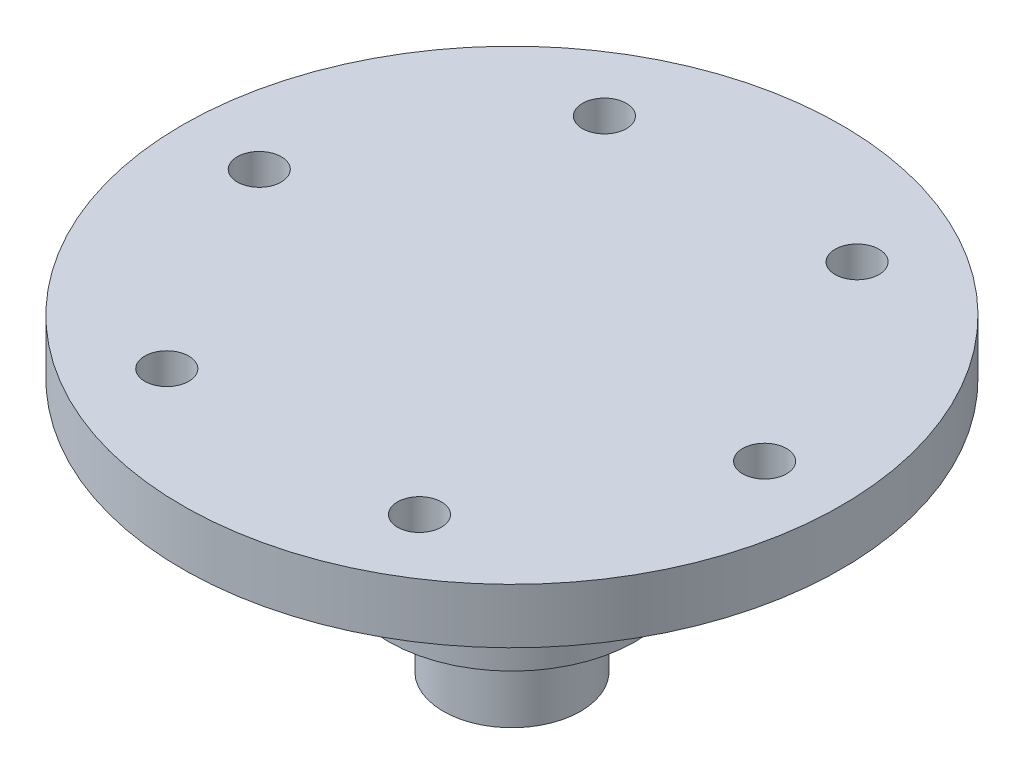
ISO-10303-21;
HEADER;
FILE_DESCRIPTION(('STEP AP214'),'2;1');
FILE_NAME('part.step','',(''),(''),'','','');
FILE_SCHEMA(('AUTOMOTIVE_DESIGN { 1 0 10303 214 1 1 1 1 }'));
ENDSEC;
DATA;
#1=APPLICATION_CONTEXT('core data for automotive mechanical design processes');
#2=APPLICATION_PROTOCOL_DEFINITION('international standard','automotive_design',2000,#1);
#3=PRODUCT_CONTEXT('',#1,'mechanical');
#4=PRODUCT('Part','Part','',(#3));
#5=PRODUCT_RELATED_PRODUCT_CATEGORY('part','',(#4));
#6=PRODUCT_DEFINITION_FORMATION('','',#4);
#7=PRODUCT_DEFINITION_CONTEXT('part definition',#1,'design');
#8=PRODUCT_DEFINITION('design','',#6,#7);
#9=PRODUCT_DEFINITION_SHAPE('','',#8);
#10=(LENGTH_UNIT() NAMED_UNIT(*) SI_UNIT(.MILLI.,.METRE.));
#11=(NAMED_UNIT(*) PLANE_ANGLE_UNIT() SI_UNIT($,.RADIAN.));
#12=(NAMED_UNIT(*) SI_UNIT($,.STERADIAN.) SOLID_ANGLE_UNIT());
#13=UNCERTAINTY_MEASURE_WITH_UNIT(LENGTH_MEASURE(1.E-05),#10,'distance_accuracy_value','');
#14=(GEOMETRIC_REPRESENTATION_CONTEXT(3) GLOBAL_UNCERTAINTY_ASSIGNED_CONTEXT((#13)) GLOBAL_UNIT_ASSIGNED_CONTEXT((#10,
#11,#12)) REPRESENTATION_CONTEXT('',''));
#15=CARTESIAN_POINT('',(0.,0.,0.));
#16=DIRECTION('',(0.,0.,1.));
#17=DIRECTION('',(1.,0.,0.));
#18=AXIS2_PLACEMENT_3D('',#15,#16,#17);
#19=CARTESIAN_POINT('',(0.,0.,0.));
#20=DIRECTION('',(0.,1.,0.));
#21=DIRECTION('',(-1.,0.,0.));
#22=AXIS2_PLACEMENT_3D('',#19,#20,#21);
#23=CYLINDRICAL_SURFACE('',#22,6.25);
#24=CARTESIAN_POINT('',(0.,3.,0.));
#25=DIRECTION('',(0.,1.,0.));
#26=DIRECTION('',(-1.,0.,0.));
#27=AXIS2_PLACEMENT_3D('',#24,#25,#26);
#28=CIRCLE('',#27,6.25);
#29=CARTESIAN_POINT('',(6.25,3.,0.));
#30=VERTEX_POINT('',#29);
#31=EDGE_CURVE('E24',#30,#30,#28,.T.);
#32=ORIENTED_EDGE('',*,*,#31,.F.);
#33=DIRECTION('',(0.,-1.,0.));
#34=VECTOR('',#33,1.);
#35=CARTESIAN_POINT('',(6.25,0.,0.));
#36=LINE('',#35,#34);
#37=CARTESIAN_POINT('',(6.25,-5.,0.));
#38=VERTEX_POINT('',#37);
#39=EDGE_CURVE('E12',#30,#38,#36,.T.);
#40=ORIENTED_EDGE('',*,*,#39,.T.);
#41=CARTESIAN_POINT('',(0.,-5.,0.));
#42=DIRECTION('',(0.,-1.,0.));
#43=DIRECTION('',(1.,0.,0.));
#44=AXIS2_PLACEMENT_3D('',#41,#42,#43);
#45=CIRCLE('',#44,6.25);
#46=EDGE_CURVE('E120',#38,#38,#45,.T.);
#47=ORIENTED_EDGE('',*,*,#46,.F.);
#48=ORIENTED_EDGE('',*,*,#39,.F.);
#49=EDGE_LOOP('',(#32,#40,#47,#48));
#50=FACE_BOUND('',#49,.T.);
#51=ADVANCED_FACE('F20',(#50),#23,.T.);
#52=CARTESIAN_POINT('',(0.,3.,0.));
#53=DIRECTION('',(0.,1.,0.));
#54=DIRECTION('',(1.,0.,0.));
#55=AXIS2_PLACEMENT_3D('',#52,#53,#54);
#56=CYLINDRICAL_SURFACE('',#55,11.25);
#57=CARTESIAN_POINT('',(0.,15.1,0.));
#58=DIRECTION('',(0.,1.,0.));
#59=DIRECTION('',(1.,0.,0.));
#60=AXIS2_PLACEMENT_3D('',#57,#58,#59);
#61=CIRCLE('',#60,11.25);
#62=CARTESIAN_POINT('',(-11.25,15.1,0.));
#63=VERTEX_POINT('',#62);
#64=EDGE_CURVE('E191',#63,#63,#61,.T.);
#65=ORIENTED_EDGE('',*,*,#64,.F.);
#66=DIRECTION('',(0.,-1.,0.));
#67=VECTOR('',#66,1.);
#68=CARTESIAN_POINT('',(-11.25,3.,0.));
#69=LINE('',#68,#67);
#70=CARTESIAN_POINT('',(-11.25,3.,0.));
#71=VERTEX_POINT('',#70);
#72=EDGE_CURVE('E32',#63,#71,#69,.T.);
#73=ORIENTED_EDGE('',*,*,#72,.T.);
#74=CARTESIAN_POINT('',(0.,3.,0.));
#75=DIRECTION('',(0.,1.,0.));
#76=DIRECTION('',(1.,0.,0.));
#77=AXIS2_PLACEMENT_3D('',#74,#75,#76);
#78=CIRCLE('',#77,11.25);
#79=EDGE_CURVE('E173',#71,#71,#78,.T.);
#80=ORIENTED_EDGE('',*,*,#79,.T.);
#81=ORIENTED_EDGE('',*,*,#72,.F.);
#82=EDGE_LOOP('',(#65,#73,#80,#81));
#83=FACE_BOUND('',#82,.T.);
#84=ADVANCED_FACE('F254',(#83),#56,.T.);
#85=CARTESIAN_POINT('',(0.,3.,0.));
#86=DIRECTION('',(0.,1.,0.));
#87=DIRECTION('',(1.,0.,0.));
#88=AXIS2_PLACEMENT_3D('',#85,#86,#87);
#89=PLANE('',#88);
#90=ORIENTED_EDGE('',*,*,#31,.T.);
#91=EDGE_LOOP('',(#90));
#92=FACE_BOUND('',#91,.T.);
#93=ORIENTED_EDGE('',*,*,#79,.F.);
#94=EDGE_LOOP('',(#93));
#95=FACE_BOUND('',#94,.T.);
#96=ADVANCED_FACE('F243',(#92,#95),#89,.F.);
#97=CARTESIAN_POINT('',(0.,15.1,0.));
#98=DIRECTION('',(0.,1.,0.));
#99=DIRECTION('',(1.,0.,0.));
#100=AXIS2_PLACEMENT_3D('',#97,#98,#99);
#101=CYLINDRICAL_SURFACE('',#100,13.);
#102=CARTESIAN_POINT('',(0.,18.1,0.));
#103=DIRECTION('',(0.,1.,0.));
#104=DIRECTION('',(1.,0.,0.));
#105=AXIS2_PLACEMENT_3D('',#102,#103,#104);
#106=CIRCLE('',#105,13.);
#107=CARTESIAN_POINT('',(-13.,18.1,0.));
#108=VERTEX_POINT('',#107);
#109=EDGE_CURVE('E132',#108,#108,#106,.T.);
#110=ORIENTED_EDGE('',*,*,#109,.F.);
#111=DIRECTION('',(0.,-1.,0.));
#112=VECTOR('',#111,1.);
#113=CARTESIAN_POINT('',(-13.,15.1,0.));
#114=LINE('',#113,#112);
#115=CARTESIAN_POINT('',(-13.,15.1,0.));
#116=VERTEX_POINT('',#115);
#117=EDGE_CURVE('E177',#108,#116,#114,.T.);
#118=ORIENTED_EDGE('',*,*,#117,.T.);
#119=CARTESIAN_POINT('',(0.,15.1,0.));
#120=DIRECTION('',(0.,1.,0.));
#121=DIRECTION('',(1.,0.,0.));
#122=AXIS2_PLACEMENT_3D('',#119,#120,#121);
#123=CIRCLE('',#122,13.);
#124=EDGE_CURVE('E186',#116,#116,#123,.T.);
#125=ORIENTED_EDGE('',*,*,#124,.T.);
#126=ORIENTED_EDGE('',*,*,#117,.F.);
#127=EDGE_LOOP('',(#110,#118,#125,#126));
#128=FACE_BOUND('',#127,.T.);
#129=ADVANCED_FACE('F274',(#128),#101,.T.);
#130=CARTESIAN_POINT('',(0.,15.1,0.));
#131=DIRECTION('',(0.,1.,0.));
#132=DIRECTION('',(1.,0.,0.));
#133=AXIS2_PLACEMENT_3D('',#130,#131,#132);
#134=PLANE('',#133);
#135=ORIENTED_EDGE('',*,*,#64,.T.);
#136=EDGE_LOOP('',(#135));
#137=FACE_BOUND('',#136,.T.);
#138=ORIENTED_EDGE('',*,*,#124,.F.);
#139=EDGE_LOOP('',(#138));
#140=FACE_BOUND('',#139,.T.);
#141=ADVANCED_FACE('F276',(#137,#140),#134,.F.);
#142=CARTESIAN_POINT('',(0.,23.1,0.));
#143=DIRECTION('',(0.,1.,0.));
#144=DIRECTION('',(1.,0.,0.));
#145=AXIS2_PLACEMENT_3D('',#142,#143,#144);
#146=PLANE('',#145);
#147=CARTESIAN_POINT('',(-23.,23.1,0.));
#148=DIRECTION('',(0.,-1.,0.));
#149=DIRECTION('',(1.,0.,0.));
#150=AXIS2_PLACEMENT_3D('',#147,#148,#149);
#151=CIRCLE('',#150,2.);
#152=CARTESIAN_POINT('',(-25.,23.1,0.));
#153=VERTEX_POINT('',#152);
#154=EDGE_CURVE('E155',#153,#153,#151,.T.);
#155=ORIENTED_EDGE('',*,*,#154,.T.);
#156=EDGE_LOOP('',(#155));
#157=FACE_BOUND('',#156,.T.);
#158=CARTESIAN_POINT('',(-11.5,23.1,19.9185842870421));
#159=DIRECTION('',(0.,-1.,0.));
#160=DIRECTION('',(0.5,0.,-0.866025403784439));
#161=AXIS2_PLACEMENT_3D('',#158,#159,#160);
#162=CIRCLE('',#161,2.);
#163=CARTESIAN_POINT('',(-12.5,23.1,21.650635094611));
#164=VERTEX_POINT('',#163);
#165=EDGE_CURVE('E170',#164,#164,#162,.T.);
#166=ORIENTED_EDGE('',*,*,#165,.T.);
#167=EDGE_LOOP('',(#166));
#168=FACE_BOUND('',#167,.T.);
#169=CARTESIAN_POINT('',(11.5,23.1,19.9185842870421));
#170=DIRECTION('',(0.,-1.,0.));
#171=DIRECTION('',(-0.5,0.,-0.866025403784439));
#172=AXIS2_PLACEMENT_3D('',#169,#170,#171);
#173=CIRCLE('',#172,2.);
#174=CARTESIAN_POINT('',(12.5,23.1,21.650635094611));
#175=VERTEX_POINT('',#174);
#176=EDGE_CURVE('E148',#175,#175,#173,.T.);
#177=ORIENTED_EDGE('',*,*,#176,.T.);
#178=EDGE_LOOP('',(#177));
#179=FACE_BOUND('',#178,.T.);
#180=CARTESIAN_POINT('',(23.,23.1,0.));
#181=DIRECTION('',(0.,-1.,0.));
#182=DIRECTION('',(-1.,0.,0.));
#183=AXIS2_PLACEMENT_3D('',#180,#181,#182);
#184=CIRCLE('',#183,2.);
#185=CARTESIAN_POINT('',(25.,23.1,0.));
#186=VERTEX_POINT('',#185);
#187=EDGE_CURVE('E220',#186,#186,#184,.T.);
#188=ORIENTED_EDGE('',*,*,#187,.T.);
#189=EDGE_LOOP('',(#188));
#190=FACE_BOUND('',#189,.T.);
#191=CARTESIAN_POINT('',(11.5,23.1,-19.9185842870421));
#192=DIRECTION('',(0.,-1.,0.));
#193=DIRECTION('',(-0.5,0.,0.866025403784438));
#194=AXIS2_PLACEMENT_3D('',#191,#192,#193);
#195=CIRCLE('',#194,2.);
#196=CARTESIAN_POINT('',(12.5,23.1,-21.650635094611));
#197=VERTEX_POINT('',#196);
#198=EDGE_CURVE('E157',#197,#197,#195,.T.);
#199=ORIENTED_EDGE('',*,*,#198,.T.);
#200=EDGE_LOOP('',(#199));
#201=FACE_BOUND('',#200,.T.);
#202=CARTESIAN_POINT('',(-11.5,23.1,-19.9185842870421));
#203=DIRECTION('',(0.,-1.,0.));
#204=DIRECTION('',(0.5,0.,0.866025403784439));
#205=AXIS2_PLACEMENT_3D('',#202,#203,#204);
#206=CIRCLE('',#205,2.);
#207=CARTESIAN_POINT('',(-12.5,23.1,-21.650635094611));
#208=VERTEX_POINT('',#207);
#209=EDGE_CURVE('E112',#208,#208,#206,.T.);
#210=ORIENTED_EDGE('',*,*,#209,.T.);
#211=EDGE_LOOP('',(#210));
#212=FACE_BOUND('',#211,.T.);
#213=CARTESIAN_POINT('',(0.,23.1,0.));
#214=DIRECTION('',(0.,1.,0.));
#215=DIRECTION('',(1.,0.,0.));
#216=AXIS2_PLACEMENT_3D('',#213,#214,#215);
#217=CIRCLE('',#216,30.);
#218=CARTESIAN_POINT('',(-30.,23.1,0.));
#219=VERTEX_POINT('',#218);
#220=EDGE_CURVE('E476',#219,#219,#217,.T.);
#221=ORIENTED_EDGE('',*,*,#220,.T.);
#222=EDGE_LOOP('',(#221));
#223=FACE_BOUND('',#222,.T.);
#224=ADVANCED_FACE('F117',(#157,#168,#179,#190,#201,#212,#223),#146,.T.);
#225=CARTESIAN_POINT('',(0.,18.1,0.));
#226=DIRECTION('',(0.,1.,0.));
#227=DIRECTION('',(1.,0.,0.));
#228=AXIS2_PLACEMENT_3D('',#225,#226,#227);
#229=CYLINDRICAL_SURFACE('',#228,30.);
#230=ORIENTED_EDGE('',*,*,#220,.F.);
#231=DIRECTION('',(0.,-1.,0.));
#232=VECTOR('',#231,1.);
#233=CARTESIAN_POINT('',(-30.,18.1,0.));
#234=LINE('',#233,#232);
#235=CARTESIAN_POINT('',(-30.,18.1,0.));
#236=VERTEX_POINT('',#235);
#237=EDGE_CURVE('E172',#219,#236,#234,.T.);
#238=ORIENTED_EDGE('',*,*,#237,.T.);
#239=CARTESIAN_POINT('',(0.,18.1,0.));
#240=DIRECTION('',(0.,1.,0.));
#241=DIRECTION('',(1.,0.,0.));
#242=AXIS2_PLACEMENT_3D('',#239,#240,#241);
#243=CIRCLE('',#242,30.);
#244=EDGE_CURVE('E141',#236,#236,#243,.T.);
#245=ORIENTED_EDGE('',*,*,#244,.T.);
#246=ORIENTED_EDGE('',*,*,#237,.F.);
#247=EDGE_LOOP('',(#230,#238,#245,#246));
#248=FACE_BOUND('',#247,.T.);
#249=ADVANCED_FACE('F262',(#248),#229,.T.);
#250=CARTESIAN_POINT('',(0.,18.1,0.));
#251=DIRECTION('',(0.,1.,0.));
#252=DIRECTION('',(1.,0.,0.));
#253=AXIS2_PLACEMENT_3D('',#250,#251,#252);
#254=PLANE('',#253);
#255=ORIENTED_EDGE('',*,*,#109,.T.);
#256=EDGE_LOOP('',(#255));
#257=FACE_BOUND('',#256,.T.);
#258=CARTESIAN_POINT('',(-23.,18.1,0.));
#259=DIRECTION('',(0.,1.,0.));
#260=DIRECTION('',(1.,0.,0.));
#261=AXIS2_PLACEMENT_3D('',#258,#259,#260);
#262=CIRCLE('',#261,2.);
#263=CARTESIAN_POINT('',(-25.,18.1,0.));
#264=VERTEX_POINT('',#263);
#265=EDGE_CURVE('E147',#264,#264,#262,.T.);
#266=ORIENTED_EDGE('',*,*,#265,.T.);
#267=EDGE_LOOP('',(#266));
#268=FACE_BOUND('',#267,.T.);
#269=CARTESIAN_POINT('',(-11.5,18.1,19.9185842870421));
#270=DIRECTION('',(0.,1.,0.));
#271=DIRECTION('',(0.5,0.,-0.866025403784439));
#272=AXIS2_PLACEMENT_3D('',#269,#270,#271);
#273=CIRCLE('',#272,2.);
#274=CARTESIAN_POINT('',(-12.5,18.1,21.650635094611));
#275=VERTEX_POINT('',#274);
#276=EDGE_CURVE('E151',#275,#275,#273,.T.);
#277=ORIENTED_EDGE('',*,*,#276,.T.);
#278=EDGE_LOOP('',(#277));
#279=FACE_BOUND('',#278,.T.);
#280=CARTESIAN_POINT('',(11.5,18.1,19.9185842870421));
#281=DIRECTION('',(0.,1.,0.));
#282=DIRECTION('',(-0.5,0.,-0.866025403784439));
#283=AXIS2_PLACEMENT_3D('',#280,#281,#282);
#284=CIRCLE('',#283,2.);
#285=CARTESIAN_POINT('',(12.5,18.1,21.650635094611));
#286=VERTEX_POINT('',#285);
#287=EDGE_CURVE('E165',#286,#286,#284,.T.);
#288=ORIENTED_EDGE('',*,*,#287,.T.);
#289=EDGE_LOOP('',(#288));
#290=FACE_BOUND('',#289,.T.);
#291=CARTESIAN_POINT('',(23.,18.1,0.));
#292=DIRECTION('',(0.,1.,0.));
#293=DIRECTION('',(-1.,0.,0.));
#294=AXIS2_PLACEMENT_3D('',#291,#292,#293);
#295=CIRCLE('',#294,2.);
#296=CARTESIAN_POINT('',(25.,18.1,0.));
#297=VERTEX_POINT('',#296);
#298=EDGE_CURVE('E129',#297,#297,#295,.T.);
#299=ORIENTED_EDGE('',*,*,#298,.T.);
#300=EDGE_LOOP('',(#299));
#301=FACE_BOUND('',#300,.T.);
#302=CARTESIAN_POINT('',(11.5,18.1,-19.9185842870421));
#303=DIRECTION('',(0.,1.,0.));
#304=DIRECTION('',(-0.5,0.,0.866025403784438));
#305=AXIS2_PLACEMENT_3D('',#302,#303,#304);
#306=CIRCLE('',#305,2.);
#307=CARTESIAN_POINT('',(12.5,18.1,-21.650635094611));
#308=VERTEX_POINT('',#307);
#309=EDGE_CURVE('E289',#308,#308,#306,.T.);
#310=ORIENTED_EDGE('',*,*,#309,.T.);
#311=EDGE_LOOP('',(#310));
#312=FACE_BOUND('',#311,.T.);
#313=CARTESIAN_POINT('',(-11.5,18.1,-19.9185842870421));
#314=DIRECTION('',(0.,1.,0.));
#315=DIRECTION('',(0.5,0.,0.866025403784439));
#316=AXIS2_PLACEMENT_3D('',#313,#314,#315);
#317=CIRCLE('',#316,2.);
#318=CARTESIAN_POINT('',(-12.5,18.1,-21.650635094611));
#319=VERTEX_POINT('',#318);
#320=EDGE_CURVE('E113',#319,#319,#317,.T.);
#321=ORIENTED_EDGE('',*,*,#320,.T.);
#322=EDGE_LOOP('',(#321));
#323=FACE_BOUND('',#322,.T.);
#324=ORIENTED_EDGE('',*,*,#244,.F.);
#325=EDGE_LOOP('',(#324));
#326=FACE_BOUND('',#325,.T.);
#327=ADVANCED_FACE('F268',(#257,#268,#279,#290,#301,#312,#323,#326),#254,.F.);
#328=CARTESIAN_POINT('',(-23.,23.1,0.));
#329=DIRECTION('',(0.,-1.,0.));
#330=DIRECTION('',(1.,0.,0.));
#331=AXIS2_PLACEMENT_3D('',#328,#329,#330);
#332=CYLINDRICAL_SURFACE('',#331,2.);
#333=ORIENTED_EDGE('',*,*,#154,.F.);
#334=DIRECTION('',(0.,-1.,0.));
#335=VECTOR('',#334,1.);
#336=CARTESIAN_POINT('',(-25.,23.1,0.));
#337=LINE('',#336,#335);
#338=EDGE_CURVE('E196',#153,#264,#337,.T.);
#339=ORIENTED_EDGE('',*,*,#338,.T.);
#340=ORIENTED_EDGE('',*,*,#265,.F.);
#341=ORIENTED_EDGE('',*,*,#338,.F.);
#342=EDGE_LOOP('',(#333,#339,#340,#341));
#343=FACE_BOUND('',#342,.T.);
#344=ADVANCED_FACE('F264',(#343),#332,.F.);
#345=CARTESIAN_POINT('',(-11.5,23.1,19.9185842870421));
#346=DIRECTION('',(0.,-1.,0.));
#347=DIRECTION('',(0.5,0.,-0.866025403784439));
#348=AXIS2_PLACEMENT_3D('',#345,#346,#347);
#349=CYLINDRICAL_SURFACE('',#348,2.);
#350=ORIENTED_EDGE('',*,*,#165,.F.);
#351=DIRECTION('',(0.,-1.,0.));
#352=VECTOR('',#351,1.);
#353=CARTESIAN_POINT('',(-12.5,23.1,21.650635094611));
#354=LINE('',#353,#352);
#355=EDGE_CURVE('E156',#164,#275,#354,.T.);
#356=ORIENTED_EDGE('',*,*,#355,.T.);
#357=ORIENTED_EDGE('',*,*,#276,.F.);
#358=ORIENTED_EDGE('',*,*,#355,.F.);
#359=EDGE_LOOP('',(#350,#356,#357,#358));
#360=FACE_BOUND('',#359,.T.);
#361=ADVANCED_FACE('F267',(#360),#349,.F.);
#362=CARTESIAN_POINT('',(11.5,23.1,19.9185842870421));
#363=DIRECTION('',(0.,-1.,0.));
#364=DIRECTION('',(-0.5,0.,-0.866025403784439));
#365=AXIS2_PLACEMENT_3D('',#362,#363,#364);
#366=CYLINDRICAL_SURFACE('',#365,2.);
#367=ORIENTED_EDGE('',*,*,#176,.F.);
#368=DIRECTION('',(0.,-1.,0.));
#369=VECTOR('',#368,1.);
#370=CARTESIAN_POINT('',(12.5,23.1,21.650635094611));
#371=LINE('',#370,#369);
#372=EDGE_CURVE('E171',#175,#286,#371,.T.);
#373=ORIENTED_EDGE('',*,*,#372,.T.);
#374=ORIENTED_EDGE('',*,*,#287,.F.);
#375=ORIENTED_EDGE('',*,*,#372,.F.);
#376=EDGE_LOOP('',(#367,#373,#374,#375));
#377=FACE_BOUND('',#376,.T.);
#378=ADVANCED_FACE('F269',(#377),#366,.F.);
#379=CARTESIAN_POINT('',(23.,23.1,0.));
#380=DIRECTION('',(0.,-1.,0.));
#381=DIRECTION('',(-1.,0.,0.));
#382=AXIS2_PLACEMENT_3D('',#379,#380,#381);
#383=CYLINDRICAL_SURFACE('',#382,2.);
#384=ORIENTED_EDGE('',*,*,#187,.F.);
#385=DIRECTION('',(0.,-1.,0.));
#386=VECTOR('',#385,1.);
#387=CARTESIAN_POINT('',(25.,23.1,0.));
#388=LINE('',#387,#386);
#389=EDGE_CURVE('E217',#186,#297,#388,.T.);
#390=ORIENTED_EDGE('',*,*,#389,.T.);
#391=ORIENTED_EDGE('',*,*,#298,.F.);
#392=ORIENTED_EDGE('',*,*,#389,.F.);
#393=EDGE_LOOP('',(#384,#390,#391,#392));
#394=FACE_BOUND('',#393,.T.);
#395=ADVANCED_FACE('F271',(#394),#383,.F.);
#396=CARTESIAN_POINT('',(11.5,23.1,-19.9185842870421));
#397=DIRECTION('',(0.,-1.,0.));
#398=DIRECTION('',(-0.5,0.,0.866025403784438));
#399=AXIS2_PLACEMENT_3D('',#396,#397,#398);
#400=CYLINDRICAL_SURFACE('',#399,2.);
#401=ORIENTED_EDGE('',*,*,#198,.F.);
#402=DIRECTION('',(0.,-1.,0.));
#403=VECTOR('',#402,1.);
#404=CARTESIAN_POINT('',(12.5,23.1,-21.650635094611));
#405=LINE('',#404,#403);
#406=EDGE_CURVE('E293',#197,#308,#405,.T.);
#407=ORIENTED_EDGE('',*,*,#406,.T.);
#408=ORIENTED_EDGE('',*,*,#309,.F.);
#409=ORIENTED_EDGE('',*,*,#406,.F.);
#410=EDGE_LOOP('',(#401,#407,#408,#409));
#411=FACE_BOUND('',#410,.T.);
#412=ADVANCED_FACE('F251',(#411),#400,.F.);
#413=CARTESIAN_POINT('',(-11.5,23.1,-19.9185842870421));
#414=DIRECTION('',(0.,-1.,0.));
#415=DIRECTION('',(0.5,0.,0.866025403784439));
#416=AXIS2_PLACEMENT_3D('',#413,#414,#415);
#417=CYLINDRICAL_SURFACE('',#416,2.);
#418=ORIENTED_EDGE('',*,*,#209,.F.);
#419=DIRECTION('',(0.,-1.,0.));
#420=VECTOR('',#419,1.);
#421=CARTESIAN_POINT('',(-12.5,23.1,-21.650635094611));
#422=LINE('',#421,#420);
#423=EDGE_CURVE('E109',#208,#319,#422,.T.);
#424=ORIENTED_EDGE('',*,*,#423,.T.);
#425=ORIENTED_EDGE('',*,*,#320,.F.);
#426=ORIENTED_EDGE('',*,*,#423,.F.);
#427=EDGE_LOOP('',(#418,#424,#425,#426));
#428=FACE_BOUND('',#427,.T.);
#429=ADVANCED_FACE('F111',(#428),#417,.F.);
#430=CARTESIAN_POINT('',(0.,-5.,0.));
#431=DIRECTION('',(0.,-1.,0.));
#432=DIRECTION('',(0.,0.,-1.));
#433=AXIS2_PLACEMENT_3D('',#430,#431,#432);
#434=PLANE('',#433);
#435=ORIENTED_EDGE('',*,*,#46,.T.);
#436=EDGE_LOOP('',(#435));
#437=FACE_BOUND('',#436,.T.);
#438=ADVANCED_FACE('F22',(#437),#434,.T.);
#439=CLOSED_SHELL('',(#51,#84,#96,#129,#141,#224,#249,#327,#344,#361,#378,#395,#412,#429,#438));
#440=MANIFOLD_SOLID_BREP('B1',#439);
#441=ADVANCED_BREP_SHAPE_REPRESENTATION('',(#18,#440),#14);
#442=SHAPE_DEFINITION_REPRESENTATION(#9,#441);
ENDSEC;
END-ISO-10303-21;
